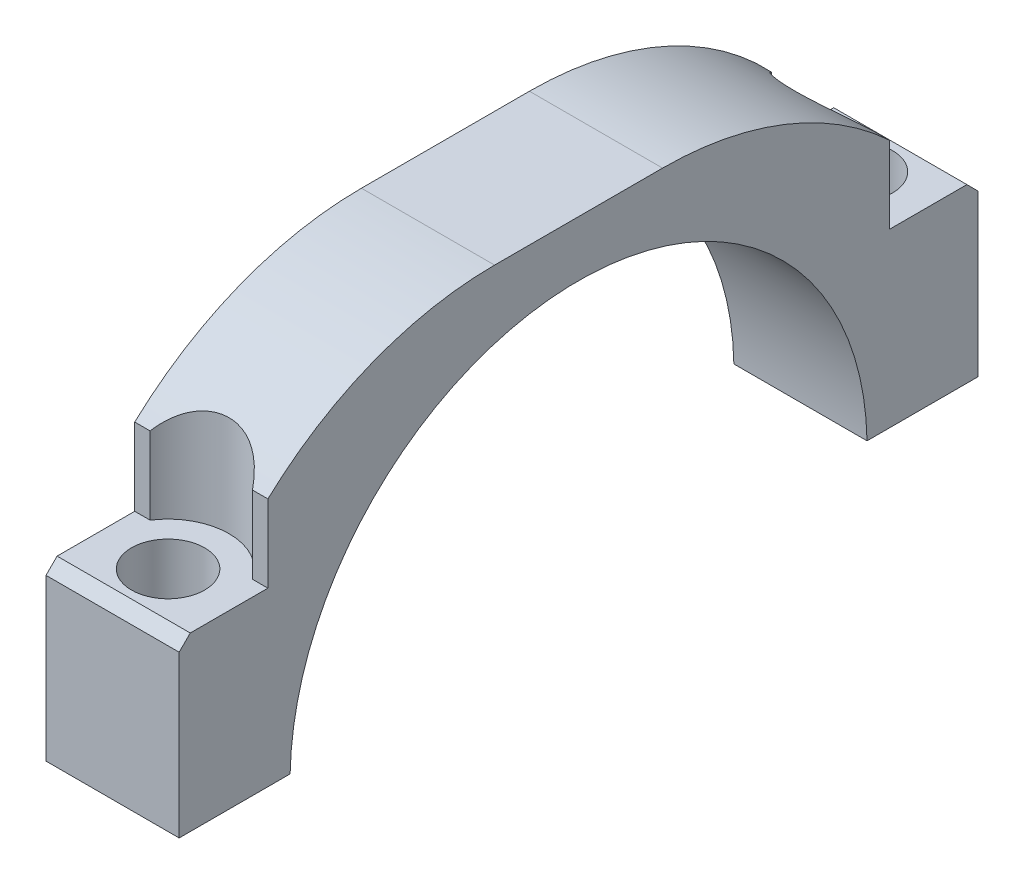
ISO-10303-21;
HEADER;
FILE_DESCRIPTION(('STEP AP214'),'2;1');
FILE_NAME('part.step','',(''),(''),'','','');
FILE_SCHEMA(('AUTOMOTIVE_DESIGN { 1 0 10303 214 1 1 1 1 }'));
ENDSEC;
DATA;
#1=APPLICATION_CONTEXT('core data for automotive mechanical design processes');
#2=APPLICATION_PROTOCOL_DEFINITION('international standard','automotive_design',2000,#1);
#3=PRODUCT_CONTEXT('',#1,'mechanical');
#4=PRODUCT('Part','Part','',(#3));
#5=PRODUCT_RELATED_PRODUCT_CATEGORY('part','',(#4));
#6=PRODUCT_DEFINITION_FORMATION('','',#4);
#7=PRODUCT_DEFINITION_CONTEXT('part definition',#1,'design');
#8=PRODUCT_DEFINITION('design','',#6,#7);
#9=PRODUCT_DEFINITION_SHAPE('','',#8);
#10=(LENGTH_UNIT() NAMED_UNIT(*) SI_UNIT(.MILLI.,.METRE.));
#11=(NAMED_UNIT(*) PLANE_ANGLE_UNIT() SI_UNIT($,.RADIAN.));
#12=(NAMED_UNIT(*) SI_UNIT($,.STERADIAN.) SOLID_ANGLE_UNIT());
#13=UNCERTAINTY_MEASURE_WITH_UNIT(LENGTH_MEASURE(1.E-05),#10,'distance_accuracy_value','');
#14=(GEOMETRIC_REPRESENTATION_CONTEXT(3) GLOBAL_UNCERTAINTY_ASSIGNED_CONTEXT((#13)) GLOBAL_UNIT_ASSIGNED_CONTEXT((#10,
#11,#12)) REPRESENTATION_CONTEXT('',''));
#15=CARTESIAN_POINT('',(0.,0.,0.));
#16=DIRECTION('',(0.,0.,1.));
#17=DIRECTION('',(1.,0.,0.));
#18=AXIS2_PLACEMENT_3D('',#15,#16,#17);
#19=CARTESIAN_POINT('',(12.,-16.,35.9951918631119));
#20=DIRECTION('',(0.,-0.707106781186548,-0.707106781186546));
#21=DIRECTION('',(-1.,0.,0.));
#22=AXIS2_PLACEMENT_3D('',#19,#20,#21);
#23=PLANE('',#22);
#24=DIRECTION('',(0.,0.707106781186547,-0.707106781186549));
#25=VECTOR('',#24,1.);
#26=CARTESIAN_POINT('',(12.,-5.50240406844402,25.4975959315559));
#27=LINE('',#26,#25);
#28=CARTESIAN_POINT('',(12.,-15.,34.9951918631119));
#29=VERTEX_POINT('',#28);
#30=CARTESIAN_POINT('',(12.,-16.,35.9951918631119));
#31=VERTEX_POINT('',#30);
#32=EDGE_CURVE('E339',#29,#31,#27,.F.);
#33=ORIENTED_EDGE('',*,*,#32,.F.);
#34=DIRECTION('',(1.,0.,0.));
#35=VECTOR('',#34,1.);
#36=CARTESIAN_POINT('',(12.,-15.,34.9951918631119));
#37=LINE('',#36,#35);
#38=CARTESIAN_POINT('',(0.,-15.,34.9951918631119));
#39=VERTEX_POINT('',#38);
#40=EDGE_CURVE('E230',#29,#39,#37,.F.);
#41=ORIENTED_EDGE('',*,*,#40,.T.);
#42=DIRECTION('',(0.,-0.707106781186547,0.707106781186549));
#43=VECTOR('',#42,1.);
#44=CARTESIAN_POINT('',(0.,-16.,35.9951918631119));
#45=LINE('',#44,#43);
#46=CARTESIAN_POINT('',(0.,-16.,35.9951918631119));
#47=VERTEX_POINT('',#46);
#48=EDGE_CURVE('E332',#47,#39,#45,.F.);
#49=ORIENTED_EDGE('',*,*,#48,.F.);
#50=DIRECTION('',(-1.,0.,0.));
#51=VECTOR('',#50,1.);
#52=CARTESIAN_POINT('',(12.,-16.,35.9951918631119));
#53=LINE('',#52,#51);
#54=EDGE_CURVE('E344',#31,#47,#53,.T.);
#55=ORIENTED_EDGE('',*,*,#54,.F.);
#56=EDGE_LOOP('',(#33,#41,#49,#55));
#57=FACE_BOUND('',#56,.T.);
#58=ADVANCED_FACE('F97',(#57),#23,.F.);
#59=CARTESIAN_POINT('',(12.,0.,-19.9951918631119));
#60=DIRECTION('',(0.,-0.707106781186546,0.707106781186548));
#61=DIRECTION('',(-1.,0.,0.));
#62=AXIS2_PLACEMENT_3D('',#59,#60,#61);
#63=PLANE('',#62);
#64=DIRECTION('',(0.,0.707106781186549,0.707106781186546));
#65=VECTOR('',#64,1.);
#66=CARTESIAN_POINT('',(0.,0.,-19.9951918631119));
#67=LINE('',#66,#65);
#68=CARTESIAN_POINT('',(0.,-15.,-34.9951918631119));
#69=VERTEX_POINT('',#68);
#70=CARTESIAN_POINT('',(0.,-16.,-35.9951918631119));
#71=VERTEX_POINT('',#70);
#72=EDGE_CURVE('E335',#69,#71,#67,.F.);
#73=ORIENTED_EDGE('',*,*,#72,.F.);
#74=DIRECTION('',(-1.,0.,0.));
#75=VECTOR('',#74,1.);
#76=CARTESIAN_POINT('',(12.,-15.,-34.9951918631119));
#77=LINE('',#76,#75);
#78=CARTESIAN_POINT('',(12.,-15.,-34.9951918631119));
#79=VERTEX_POINT('',#78);
#80=EDGE_CURVE('E278',#69,#79,#77,.F.);
#81=ORIENTED_EDGE('',*,*,#80,.T.);
#82=DIRECTION('',(0.,-0.707106781186549,-0.707106781186546));
#83=VECTOR('',#82,1.);
#84=CARTESIAN_POINT('',(12.,-5.50240406844408,-25.497595931556));
#85=LINE('',#84,#83);
#86=CARTESIAN_POINT('',(12.,-16.,-35.9951918631119));
#87=VERTEX_POINT('',#86);
#88=EDGE_CURVE('E341',#87,#79,#85,.F.);
#89=ORIENTED_EDGE('',*,*,#88,.F.);
#90=DIRECTION('',(1.,0.,0.));
#91=VECTOR('',#90,1.);
#92=CARTESIAN_POINT('',(12.,-16.,-35.9951918631119));
#93=LINE('',#92,#91);
#94=EDGE_CURVE('E337',#71,#87,#93,.T.);
#95=ORIENTED_EDGE('',*,*,#94,.F.);
#96=EDGE_LOOP('',(#73,#81,#89,#95));
#97=FACE_BOUND('',#96,.T.);
#98=ADVANCED_FACE('F389',(#97),#63,.F.);
#99=CARTESIAN_POINT('',(6.,-30.5000000000001,-30.9951918631119));
#100=DIRECTION('',(0.,-1.,0.));
#101=DIRECTION('',(0.,0.,-1.));
#102=AXIS2_PLACEMENT_3D('',#99,#100,#101);
#103=CYLINDRICAL_SURFACE('',#102,3.29999999999999);
#104=CARTESIAN_POINT('',(6.,-30.5000000000001,-30.9951918631119));
#105=DIRECTION('',(0.,-1.,0.));
#106=DIRECTION('',(0.,0.,-1.));
#107=AXIS2_PLACEMENT_3D('',#104,#105,#106);
#108=CIRCLE('',#107,3.3);
#109=CARTESIAN_POINT('',(6.,-30.5000000000001,-34.2951918631119));
#110=VERTEX_POINT('',#109);
#111=EDGE_CURVE('E289',#110,#110,#108,.T.);
#112=ORIENTED_EDGE('',*,*,#111,.T.);
#113=EDGE_LOOP('',(#112));
#114=FACE_BOUND('',#113,.T.);
#115=CARTESIAN_POINT('',(6.,-15.,-30.9951918631119));
#116=DIRECTION('',(0.,1.,0.));
#117=DIRECTION('',(0.,0.,1.));
#118=AXIS2_PLACEMENT_3D('',#115,#116,#117);
#119=CIRCLE('',#118,3.29999999999999);
#120=CARTESIAN_POINT('',(6.,-15.,-27.6951918631119));
#121=VERTEX_POINT('',#120);
#122=EDGE_CURVE('E277',#121,#121,#119,.F.);
#123=ORIENTED_EDGE('',*,*,#122,.F.);
#124=EDGE_LOOP('',(#123));
#125=FACE_BOUND('',#124,.T.);
#126=ADVANCED_FACE('F385',(#114,#125),#103,.F.);
#127=CARTESIAN_POINT('',(6.,-30.5000000000001,30.9951918631119));
#128=DIRECTION('',(0.,-1.,0.));
#129=DIRECTION('',(0.,0.,-1.));
#130=AXIS2_PLACEMENT_3D('',#127,#128,#129);
#131=CYLINDRICAL_SURFACE('',#130,3.29999999999999);
#132=CARTESIAN_POINT('',(6.,-30.5000000000001,30.9951918631119));
#133=DIRECTION('',(0.,-1.,0.));
#134=DIRECTION('',(0.,0.,-1.));
#135=AXIS2_PLACEMENT_3D('',#132,#133,#134);
#136=CIRCLE('',#135,3.3);
#137=CARTESIAN_POINT('',(6.,-30.5000000000001,27.6951918631119));
#138=VERTEX_POINT('',#137);
#139=EDGE_CURVE('E286',#138,#138,#136,.T.);
#140=ORIENTED_EDGE('',*,*,#139,.T.);
#141=EDGE_LOOP('',(#140));
#142=FACE_BOUND('',#141,.T.);
#143=CARTESIAN_POINT('',(6.,-15.,30.9951918631119));
#144=DIRECTION('',(0.,1.,0.));
#145=DIRECTION('',(0.,0.,1.));
#146=AXIS2_PLACEMENT_3D('',#143,#144,#145);
#147=CIRCLE('',#146,3.29999999999999);
#148=CARTESIAN_POINT('',(6.,-15.,34.2951918631119));
#149=VERTEX_POINT('',#148);
#150=EDGE_CURVE('E283',#149,#149,#147,.F.);
#151=ORIENTED_EDGE('',*,*,#150,.F.);
#152=EDGE_LOOP('',(#151));
#153=FACE_BOUND('',#152,.T.);
#154=ADVANCED_FACE('F381',(#142,#153),#131,.F.);
#155=CARTESIAN_POINT('',(12.,0.,35.9951918631119));
#156=DIRECTION('',(0.,0.,-1.));
#157=DIRECTION('',(0.,1.,0.));
#158=AXIS2_PLACEMENT_3D('',#155,#156,#157);
#159=PLANE('',#158);
#160=DIRECTION('',(0.,-1.,0.));
#161=VECTOR('',#160,1.);
#162=CARTESIAN_POINT('',(12.,0.,35.9951918631119));
#163=LINE('',#162,#161);
#164=CARTESIAN_POINT('',(12.,-30.5,35.9951918631119));
#165=VERTEX_POINT('',#164);
#166=EDGE_CURVE('E293',#31,#165,#163,.T.);
#167=ORIENTED_EDGE('',*,*,#166,.F.);
#168=ORIENTED_EDGE('',*,*,#54,.T.);
#169=DIRECTION('',(0.,-1.,0.));
#170=VECTOR('',#169,1.);
#171=CARTESIAN_POINT('',(0.,0.,35.9951918631119));
#172=LINE('',#171,#170);
#173=CARTESIAN_POINT('',(0.,-30.5,35.9951918631119));
#174=VERTEX_POINT('',#173);
#175=EDGE_CURVE('E292',#47,#174,#172,.T.);
#176=ORIENTED_EDGE('',*,*,#175,.T.);
#177=DIRECTION('',(-1.,0.,0.));
#178=VECTOR('',#177,1.);
#179=CARTESIAN_POINT('',(12.,-30.5,35.9951918631119));
#180=LINE('',#179,#178);
#181=EDGE_CURVE('E329',#165,#174,#180,.T.);
#182=ORIENTED_EDGE('',*,*,#181,.F.);
#183=EDGE_LOOP('',(#167,#168,#176,#182));
#184=FACE_BOUND('',#183,.T.);
#185=ADVANCED_FACE('F384',(#184),#159,.F.);
#186=CARTESIAN_POINT('',(12.,-30.5,35.9951918631119));
#187=DIRECTION('',(0.,1.,0.));
#188=DIRECTION('',(0.,0.,1.));
#189=AXIS2_PLACEMENT_3D('',#186,#187,#188);
#190=PLANE('',#189);
#191=ORIENTED_EDGE('',*,*,#139,.F.);
#192=EDGE_LOOP('',(#191));
#193=FACE_BOUND('',#192,.T.);
#194=DIRECTION('',(0.,0.,-1.));
#195=VECTOR('',#194,1.);
#196=CARTESIAN_POINT('',(0.,-30.5,35.9951918631119));
#197=LINE('',#196,#195);
#198=CARTESIAN_POINT('',(0.,-30.5,25.9951918631119));
#199=VERTEX_POINT('',#198);
#200=EDGE_CURVE('E309',#174,#199,#197,.T.);
#201=ORIENTED_EDGE('',*,*,#200,.T.);
#202=DIRECTION('',(-1.,0.,0.));
#203=VECTOR('',#202,1.);
#204=CARTESIAN_POINT('',(12.,-30.5,25.9951918631119));
#205=LINE('',#204,#203);
#206=CARTESIAN_POINT('',(12.,-30.5,25.9951918631119));
#207=VERTEX_POINT('',#206);
#208=EDGE_CURVE('E326',#207,#199,#205,.T.);
#209=ORIENTED_EDGE('',*,*,#208,.F.);
#210=DIRECTION('',(0.,0.,-1.));
#211=VECTOR('',#210,1.);
#212=CARTESIAN_POINT('',(12.,-30.5,35.9951918631119));
#213=LINE('',#212,#211);
#214=EDGE_CURVE('E295',#165,#207,#213,.T.);
#215=ORIENTED_EDGE('',*,*,#214,.F.);
#216=ORIENTED_EDGE('',*,*,#181,.T.);
#217=EDGE_LOOP('',(#201,#209,#215,#216));
#218=FACE_BOUND('',#217,.T.);
#219=ADVANCED_FACE('F413',(#193,#218),#190,.F.);
#220=CARTESIAN_POINT('',(12.,-31.,0.));
#221=DIRECTION('',(-1.,0.,0.));
#222=DIRECTION('',(0.,0.,1.));
#223=AXIS2_PLACEMENT_3D('',#220,#221,#222);
#224=CYLINDRICAL_SURFACE('',#223,26.);
#225=CARTESIAN_POINT('',(0.,-31.,0.));
#226=DIRECTION('',(-1.,0.,0.));
#227=DIRECTION('',(0.,0.,-1.));
#228=AXIS2_PLACEMENT_3D('',#225,#226,#227);
#229=CIRCLE('',#228,26.);
#230=CARTESIAN_POINT('',(0.,-30.5,-25.9951918631119));
#231=VERTEX_POINT('',#230);
#232=EDGE_CURVE('E311',#199,#231,#229,.T.);
#233=ORIENTED_EDGE('',*,*,#232,.T.);
#234=DIRECTION('',(-1.,0.,0.));
#235=VECTOR('',#234,1.);
#236=CARTESIAN_POINT('',(12.,-30.5,-25.9951918631119));
#237=LINE('',#236,#235);
#238=CARTESIAN_POINT('',(12.,-30.5,-25.9951918631119));
#239=VERTEX_POINT('',#238);
#240=EDGE_CURVE('E323',#239,#231,#237,.T.);
#241=ORIENTED_EDGE('',*,*,#240,.F.);
#242=CARTESIAN_POINT('',(12.,-31.,0.));
#243=DIRECTION('',(-1.,0.,0.));
#244=DIRECTION('',(0.,0.,-1.));
#245=AXIS2_PLACEMENT_3D('',#242,#243,#244);
#246=CIRCLE('',#245,26.);
#247=EDGE_CURVE('E298',#207,#239,#246,.T.);
#248=ORIENTED_EDGE('',*,*,#247,.F.);
#249=ORIENTED_EDGE('',*,*,#208,.T.);
#250=EDGE_LOOP('',(#233,#241,#248,#249));
#251=FACE_BOUND('',#250,.T.);
#252=ADVANCED_FACE('F409',(#251),#224,.F.);
#253=CARTESIAN_POINT('',(12.,-30.5,-35.9951918631119));
#254=DIRECTION('',(0.,1.,0.));
#255=DIRECTION('',(0.,0.,1.));
#256=AXIS2_PLACEMENT_3D('',#253,#254,#255);
#257=PLANE('',#256);
#258=ORIENTED_EDGE('',*,*,#111,.F.);
#259=EDGE_LOOP('',(#258));
#260=FACE_BOUND('',#259,.T.);
#261=DIRECTION('',(0.,0.,-1.));
#262=VECTOR('',#261,1.);
#263=CARTESIAN_POINT('',(0.,-30.5,-35.9951918631119));
#264=LINE('',#263,#262);
#265=CARTESIAN_POINT('',(0.,-30.5,-35.9951918631119));
#266=VERTEX_POINT('',#265);
#267=EDGE_CURVE('E314',#231,#266,#264,.T.);
#268=ORIENTED_EDGE('',*,*,#267,.T.);
#269=DIRECTION('',(-1.,0.,0.));
#270=VECTOR('',#269,1.);
#271=CARTESIAN_POINT('',(12.,-30.5,-35.9951918631119));
#272=LINE('',#271,#270);
#273=CARTESIAN_POINT('',(12.,-30.5,-35.9951918631119));
#274=VERTEX_POINT('',#273);
#275=EDGE_CURVE('E307',#274,#266,#272,.T.);
#276=ORIENTED_EDGE('',*,*,#275,.F.);
#277=DIRECTION('',(0.,0.,-1.));
#278=VECTOR('',#277,1.);
#279=CARTESIAN_POINT('',(12.,-30.5,-35.9951918631119));
#280=LINE('',#279,#278);
#281=EDGE_CURVE('E300',#239,#274,#280,.T.);
#282=ORIENTED_EDGE('',*,*,#281,.F.);
#283=ORIENTED_EDGE('',*,*,#240,.T.);
#284=EDGE_LOOP('',(#268,#276,#282,#283));
#285=FACE_BOUND('',#284,.T.);
#286=ADVANCED_FACE('F405',(#260,#285),#257,.F.);
#287=CARTESIAN_POINT('',(12.,0.,-35.9951918631119));
#288=DIRECTION('',(0.,0.,1.));
#289=DIRECTION('',(0.,-1.,0.));
#290=AXIS2_PLACEMENT_3D('',#287,#288,#289);
#291=PLANE('',#290);
#292=DIRECTION('',(0.,1.,0.));
#293=VECTOR('',#292,1.);
#294=CARTESIAN_POINT('',(0.,0.,-35.9951918631119));
#295=LINE('',#294,#293);
#296=EDGE_CURVE('E316',#266,#71,#295,.T.);
#297=ORIENTED_EDGE('',*,*,#296,.T.);
#298=ORIENTED_EDGE('',*,*,#94,.T.);
#299=DIRECTION('',(0.,1.,0.));
#300=VECTOR('',#299,1.);
#301=CARTESIAN_POINT('',(12.,0.,-35.9951918631119));
#302=LINE('',#301,#300);
#303=EDGE_CURVE('E302',#274,#87,#302,.T.);
#304=ORIENTED_EDGE('',*,*,#303,.F.);
#305=ORIENTED_EDGE('',*,*,#275,.T.);
#306=EDGE_LOOP('',(#297,#298,#304,#305));
#307=FACE_BOUND('',#306,.T.);
#308=ADVANCED_FACE('F401',(#307),#291,.F.);
#309=CARTESIAN_POINT('',(12.,0.,35.9951918631119));
#310=DIRECTION('',(0.,-1.,0.));
#311=DIRECTION('',(0.,0.,-1.));
#312=AXIS2_PLACEMENT_3D('',#309,#310,#311);
#313=PLANE('',#312);
#314=DIRECTION('',(0.,0.,1.));
#315=VECTOR('',#314,1.);
#316=CARTESIAN_POINT('',(12.,0.,35.9951918631119));
#317=LINE('',#316,#315);
#318=CARTESIAN_POINT('',(12.,0.,-7.56878499191906));
#319=VERTEX_POINT('',#318);
#320=CARTESIAN_POINT('',(12.,0.,7.56878499191905));
#321=VERTEX_POINT('',#320);
#322=EDGE_CURVE('E305',#319,#321,#317,.T.);
#323=ORIENTED_EDGE('',*,*,#322,.F.);
#324=DIRECTION('',(1.,0.,0.));
#325=VECTOR('',#324,1.);
#326=CARTESIAN_POINT('',(0.,0.,-7.56878499191907));
#327=LINE('',#326,#325);
#328=CARTESIAN_POINT('',(0.,0.,-7.56878499191906));
#329=VERTEX_POINT('',#328);
#330=EDGE_CURVE('E350',#319,#329,#327,.F.);
#331=ORIENTED_EDGE('',*,*,#330,.T.);
#332=DIRECTION('',(0.,0.,1.));
#333=VECTOR('',#332,1.);
#334=CARTESIAN_POINT('',(0.,0.,35.9951918631119));
#335=LINE('',#334,#333);
#336=CARTESIAN_POINT('',(0.,0.,7.56878499191905));
#337=VERTEX_POINT('',#336);
#338=EDGE_CURVE('E296',#329,#337,#335,.T.);
#339=ORIENTED_EDGE('',*,*,#338,.T.);
#340=DIRECTION('',(-1.,0.,0.));
#341=VECTOR('',#340,1.);
#342=CARTESIAN_POINT('',(12.,0.,7.56878499191905));
#343=LINE('',#342,#341);
#344=EDGE_CURVE('E347',#337,#321,#343,.F.);
#345=ORIENTED_EDGE('',*,*,#344,.T.);
#346=EDGE_LOOP('',(#323,#331,#339,#345));
#347=FACE_BOUND('',#346,.T.);
#348=ADVANCED_FACE('F394',(#347),#313,.F.);
#349=CARTESIAN_POINT('',(12.,-31.,0.));
#350=DIRECTION('',(1.,0.,0.));
#351=DIRECTION('',(0.,0.,-1.));
#352=AXIS2_PLACEMENT_3D('',#349,#350,#351);
#353=PLANE('',#352);
#354=DIRECTION('',(0.,1.,0.));
#355=VECTOR('',#354,1.);
#356=CARTESIAN_POINT('',(12.,-31.,28.));
#357=LINE('',#356,#355);
#358=CARTESIAN_POINT('',(12.,-15.,28.));
#359=VERTEX_POINT('',#358);
#360=CARTESIAN_POINT('',(12.,-8.03262752868319,28.));
#361=VERTEX_POINT('',#360);
#362=EDGE_CURVE('E240',#359,#361,#357,.T.);
#363=ORIENTED_EDGE('',*,*,#362,.F.);
#364=DIRECTION('',(0.,0.,1.));
#365=VECTOR('',#364,1.);
#366=CARTESIAN_POINT('',(12.,-15.,0.));
#367=LINE('',#366,#365);
#368=EDGE_CURVE('E227',#359,#29,#367,.T.);
#369=ORIENTED_EDGE('',*,*,#368,.T.);
#370=ORIENTED_EDGE('',*,*,#32,.T.);
#371=ORIENTED_EDGE('',*,*,#166,.T.);
#372=ORIENTED_EDGE('',*,*,#214,.T.);
#373=ORIENTED_EDGE('',*,*,#247,.T.);
#374=ORIENTED_EDGE('',*,*,#281,.T.);
#375=ORIENTED_EDGE('',*,*,#303,.T.);
#376=ORIENTED_EDGE('',*,*,#88,.T.);
#377=DIRECTION('',(0.,0.,1.));
#378=VECTOR('',#377,1.);
#379=CARTESIAN_POINT('',(12.,-15.,0.));
#380=LINE('',#379,#378);
#381=CARTESIAN_POINT('',(12.,-15.,-28.));
#382=VERTEX_POINT('',#381);
#383=EDGE_CURVE('E262',#79,#382,#380,.T.);
#384=ORIENTED_EDGE('',*,*,#383,.T.);
#385=DIRECTION('',(0.,-1.,0.));
#386=VECTOR('',#385,1.);
#387=CARTESIAN_POINT('',(12.,-31.,-28.));
#388=LINE('',#387,#386);
#389=CARTESIAN_POINT('',(12.,-8.03262752868317,-28.));
#390=VERTEX_POINT('',#389);
#391=EDGE_CURVE('E273',#390,#382,#388,.T.);
#392=ORIENTED_EDGE('',*,*,#391,.F.);
#393=CARTESIAN_POINT('',(12.,-30.,-7.56878499191907));
#394=DIRECTION('',(1.,0.,0.));
#395=DIRECTION('',(0.,0.,-1.));
#396=AXIS2_PLACEMENT_3D('',#393,#394,#395);
#397=CIRCLE('',#396,30.);
#398=EDGE_CURVE('E359',#390,#319,#397,.T.);
#399=ORIENTED_EDGE('',*,*,#398,.T.);
#400=ORIENTED_EDGE('',*,*,#322,.T.);
#401=CARTESIAN_POINT('',(12.,-30.,7.56878499191905));
#402=DIRECTION('',(1.,0.,0.));
#403=DIRECTION('',(0.,0.,-1.));
#404=AXIS2_PLACEMENT_3D('',#401,#402,#403);
#405=CIRCLE('',#404,30.);
#406=EDGE_CURVE('E250',#321,#361,#405,.T.);
#407=ORIENTED_EDGE('',*,*,#406,.T.);
#408=EDGE_LOOP('',(#363,#369,#370,#371,#372,#373,#374,#375,#376,#384,#392,#399,#400,#407));
#409=FACE_BOUND('',#408,.T.);
#410=ADVANCED_FACE('F248',(#409),#353,.T.);
#411=CARTESIAN_POINT('',(0.,-31.,0.));
#412=DIRECTION('',(1.,0.,0.));
#413=DIRECTION('',(0.,0.,-1.));
#414=AXIS2_PLACEMENT_3D('',#411,#412,#413);
#415=PLANE('',#414);
#416=DIRECTION('',(0.,0.,1.));
#417=VECTOR('',#416,1.);
#418=CARTESIAN_POINT('',(0.,-15.,0.));
#419=LINE('',#418,#417);
#420=CARTESIAN_POINT('',(0.,-15.,28.));
#421=VERTEX_POINT('',#420);
#422=EDGE_CURVE('E236',#421,#39,#419,.T.);
#423=ORIENTED_EDGE('',*,*,#422,.F.);
#424=DIRECTION('',(0.,1.,0.));
#425=VECTOR('',#424,1.);
#426=CARTESIAN_POINT('',(0.,-31.,28.));
#427=LINE('',#426,#425);
#428=CARTESIAN_POINT('',(0.,-8.03262752868319,28.));
#429=VERTEX_POINT('',#428);
#430=EDGE_CURVE('E254',#421,#429,#427,.T.);
#431=ORIENTED_EDGE('',*,*,#430,.T.);
#432=CARTESIAN_POINT('',(0.,-30.,7.56878499191905));
#433=DIRECTION('',(1.,0.,0.));
#434=DIRECTION('',(0.,0.,-1.));
#435=AXIS2_PLACEMENT_3D('',#432,#433,#434);
#436=CIRCLE('',#435,30.);
#437=EDGE_CURVE('E353',#429,#337,#436,.F.);
#438=ORIENTED_EDGE('',*,*,#437,.T.);
#439=ORIENTED_EDGE('',*,*,#338,.F.);
#440=CARTESIAN_POINT('',(0.,-30.,-7.56878499191907));
#441=DIRECTION('',(1.,0.,0.));
#442=DIRECTION('',(0.,0.,-1.));
#443=AXIS2_PLACEMENT_3D('',#440,#441,#442);
#444=CIRCLE('',#443,30.);
#445=CARTESIAN_POINT('',(0.,-8.03262752868317,-28.));
#446=VERTEX_POINT('',#445);
#447=EDGE_CURVE('E355',#329,#446,#444,.F.);
#448=ORIENTED_EDGE('',*,*,#447,.T.);
#449=DIRECTION('',(0.,-1.,0.));
#450=VECTOR('',#449,1.);
#451=CARTESIAN_POINT('',(0.,-31.,-28.));
#452=LINE('',#451,#450);
#453=CARTESIAN_POINT('',(0.,-15.,-28.));
#454=VERTEX_POINT('',#453);
#455=EDGE_CURVE('E269',#446,#454,#452,.T.);
#456=ORIENTED_EDGE('',*,*,#455,.T.);
#457=DIRECTION('',(0.,0.,1.));
#458=VECTOR('',#457,1.);
#459=CARTESIAN_POINT('',(0.,-15.,0.));
#460=LINE('',#459,#458);
#461=EDGE_CURVE('E265',#69,#454,#460,.T.);
#462=ORIENTED_EDGE('',*,*,#461,.F.);
#463=ORIENTED_EDGE('',*,*,#72,.T.);
#464=ORIENTED_EDGE('',*,*,#296,.F.);
#465=ORIENTED_EDGE('',*,*,#267,.F.);
#466=ORIENTED_EDGE('',*,*,#232,.F.);
#467=ORIENTED_EDGE('',*,*,#200,.F.);
#468=ORIENTED_EDGE('',*,*,#175,.F.);
#469=ORIENTED_EDGE('',*,*,#48,.T.);
#470=EDGE_LOOP('',(#423,#431,#438,#439,#448,#456,#462,#463,#464,#465,#466,#467,#468,#469));
#471=FACE_BOUND('',#470,.T.);
#472=ADVANCED_FACE('F393',(#471),#415,.F.);
#473=CARTESIAN_POINT('',(12.,-30.,-7.56878499191907));
#474=DIRECTION('',(-1.,0.,0.));
#475=DIRECTION('',(0.,0.,1.));
#476=AXIS2_PLACEMENT_3D('',#473,#474,#475);
#477=CYLINDRICAL_SURFACE('',#476,30.);
#478=DIRECTION('',(-1.,0.,0.));
#479=VECTOR('',#478,1.);
#480=CARTESIAN_POINT('',(12.,-8.03262752868317,-28.));
#481=LINE('',#480,#479);
#482=CARTESIAN_POINT('',(1.3871022444511,-8.03262752868317,-28.));
#483=VERTEX_POINT('',#482);
#484=EDGE_CURVE('E267',#446,#483,#481,.F.);
#485=ORIENTED_EDGE('',*,*,#484,.F.);
#486=ORIENTED_EDGE('',*,*,#447,.F.);
#487=ORIENTED_EDGE('',*,*,#330,.F.);
#488=ORIENTED_EDGE('',*,*,#398,.F.);
#489=CARTESIAN_POINT('',(10.6128977555489,-8.03262752868317,-28.));
#490=VERTEX_POINT('',#489);
#491=EDGE_CURVE('E270',#490,#390,#481,.F.);
#492=ORIENTED_EDGE('',*,*,#491,.F.);
#493=CARTESIAN_POINT('',(1.12914080516294,-15.,-33.5495471054522));
#494=CARTESIAN_POINT('',(1.07037826514827,-14.805863851197,-33.4374657080568));
#495=CARTESIAN_POINT('',(1.01513060567362,-14.6121767394934,-33.3227359781441));
#496=CARTESIAN_POINT('',(0.912110179795308,-14.2259497872558,-33.088000882944));
#497=CARTESIAN_POINT('',(0.864339251760836,-14.0334102400427,-32.9679942294357));
#498=CARTESIAN_POINT('',(0.776558819232649,-13.6490003537471,-32.7222553660083));
#499=CARTESIAN_POINT('',(0.736583493650419,-13.4571364300004,-32.5965008002143));
#500=CARTESIAN_POINT('',(0.665249122327001,-13.0752777953063,-32.339871402251));
#501=CARTESIAN_POINT('',(0.633889472350553,-12.8852829541779,-32.2089969298873));
#502=CARTESIAN_POINT('',(0.552921333115735,-12.3129877704568,-31.8049078152736));
#503=CARTESIAN_POINT('',(0.517749784805714,-11.9340228104916,-31.5238281447705));
#504=CARTESIAN_POINT('',(0.492600330044044,-11.1893979465917,-30.9436256955275));
#505=CARTESIAN_POINT('',(0.502530988529331,-10.8237126376714,-30.6445406331523));
#506=CARTESIAN_POINT('',(0.557416944282137,-10.2918106979647,-30.1882619558858));
#507=CARTESIAN_POINT('',(0.581965058228471,-10.1188326567222,-30.0363573415844));
#508=CARTESIAN_POINT('',(0.645231309066514,-9.77780667742746,-29.7299081564722));
#509=CARTESIAN_POINT('',(0.683949869863115,-9.60975888702472,-29.5753635068173));
#510=CARTESIAN_POINT('',(0.776649500998128,-9.28009949696876,-29.2652527923666));
#511=CARTESIAN_POINT('',(0.83057155110552,-9.11846571282006,-29.109692906146));
#512=CARTESIAN_POINT('',(0.955000217996856,-8.80201295867417,-28.7983562044466));
#513=CARTESIAN_POINT('',(1.02550371949719,-8.64719271504353,-28.6425794351737));
#514=CARTESIAN_POINT('',(1.23576170189845,-8.24797336671048,-28.2321724692718));
#515=CARTESIAN_POINT('',(1.39084818186247,-8.01022357788019,-27.9786060750825));
#516=CARTESIAN_POINT('',(1.75443755131895,-7.56251889937233,-27.48536703564));
#517=CARTESIAN_POINT('',(1.9628955234413,-7.35254086129932,-27.245682914071));
#518=CARTESIAN_POINT('',(2.38587647119762,-7.00815894974485,-26.8413161123711));
#519=CARTESIAN_POINT('',(2.58994661884033,-6.86714267474415,-26.6714494146115));
#520=CARTESIAN_POINT('',(2.92091803310384,-6.67523896643961,-26.4358426307969));
#521=CARTESIAN_POINT('',(3.03543495350841,-6.61452164094924,-26.3604806682041));
#522=CARTESIAN_POINT('',(3.27234659019942,-6.5001203014445,-26.2172175182988));
#523=CARTESIAN_POINT('',(3.39473782365235,-6.44643320939835,-26.149313067995));
#524=CARTESIAN_POINT('',(3.64781589113069,-6.34617328931503,-26.0215122334604));
#525=CARTESIAN_POINT('',(3.7785611292609,-6.29966065083293,-25.9616840765395));
#526=CARTESIAN_POINT('',(4.04654749760141,-6.21475297525036,-25.8517510877022));
#527=CARTESIAN_POINT('',(4.18378537457409,-6.17635392434704,-25.8016414490339));
#528=CARTESIAN_POINT('',(4.46371303605967,-6.10806603163086,-25.7120666071699));
#529=CARTESIAN_POINT('',(4.60640139313891,-6.07817497874424,-25.6725986385388));
#530=CARTESIAN_POINT('',(4.89599193923397,-6.02722986718919,-25.6050841707157));
#531=CARTESIAN_POINT('',(5.0428935183196,-6.00617453624075,-25.5770360271687));
#532=CARTESIAN_POINT('',(5.32092237295183,-5.97520881388857,-25.5356985653719));
#533=CARTESIAN_POINT('',(5.45172441182689,-5.96423382131593,-25.5210020227954));
#534=CARTESIAN_POINT('',(5.71444134285945,-5.94933022000542,-25.5010308496226));
#535=CARTESIAN_POINT('',(5.84635614205788,-5.9454010284111,-25.4957554396731));
#536=CARTESIAN_POINT('',(6.11019701176323,-5.94462501306384,-25.4947140881422));
#537=CARTESIAN_POINT('',(6.24212306295836,-5.94777576566852,-25.4989448923452));
#538=CARTESIAN_POINT('',(6.50497363234935,-5.96112544119957,-25.5168387715571));
#539=CARTESIAN_POINT('',(6.63589816597809,-5.97132425529675,-25.5305017009243));
#540=CARTESIAN_POINT('',(6.8882449103671,-5.99788893152819,-25.565982620654));
#541=CARTESIAN_POINT('',(7.00978088992425,-6.01386680521137,-25.5872869680389));
#542=CARTESIAN_POINT('',(7.25027978662581,-6.0518778819671,-25.6377762455569));
#543=CARTESIAN_POINT('',(7.36924187035121,-6.0739130156214,-25.6669636881536));
#544=CARTESIAN_POINT('',(7.60376380357122,-6.12385562150669,-25.732799788706));
#545=CARTESIAN_POINT('',(7.71932495443044,-6.15176081336448,-25.7694455491097));
#546=CARTESIAN_POINT('',(7.94647889465897,-6.21325010456801,-25.8497337077988));
#547=CARTESIAN_POINT('',(8.05807016662662,-6.24683634773818,-25.8933787470364));
#548=CARTESIAN_POINT('',(8.2810059566507,-6.32088045437415,-25.9889665894517));
#549=CARTESIAN_POINT('',(8.39216637919304,-6.36155745483907,-26.0411691846698));
#550=CARTESIAN_POINT('',(8.6090524406748,-6.44848984347889,-26.1518776416192));
#551=CARTESIAN_POINT('',(8.71477609691565,-6.49474724644416,-26.2103857791327));
#552=CARTESIAN_POINT('',(9.02311604214602,-6.64141558075713,-26.3943276847275));
#553=CARTESIAN_POINT('',(9.21703249228455,-6.74976655346231,-26.5282362920548));
#554=CARTESIAN_POINT('',(9.60169696523847,-6.99934361728875,-26.8304756241306));
#555=CARTESIAN_POINT('',(9.78911236600621,-7.14297521994728,-27.0010146276169));
#556=CARTESIAN_POINT('',(10.1315565011359,-7.44989062315936,-27.3563484155473));
#557=CARTESIAN_POINT('',(10.2865646024996,-7.6131868401055,-27.5411521801587));
#558=CARTESIAN_POINT('',(10.5336419488239,-7.91710684220023,-27.876046388907));
#559=CARTESIAN_POINT('',(10.6320145802048,-8.05448846848921,-28.0245185499414));
#560=CARTESIAN_POINT('',(10.8110482090651,-8.33768490779127,-28.3241841183826));
#561=CARTESIAN_POINT('',(10.8917016762136,-8.48350327313904,-28.4753786533311));
#562=CARTESIAN_POINT('',(11.0364779635911,-8.78257797129881,-28.7788411020993));
#563=CARTESIAN_POINT('',(11.1005714380757,-8.93584694405941,-28.9311104367891));
#564=CARTESIAN_POINT('',(11.213248288302,-9.24854183550018,-29.2349926182621));
#565=CARTESIAN_POINT('',(11.2618317946676,-9.40796770231476,-29.3866054705634));
#566=CARTESIAN_POINT('',(11.3629825860313,-9.80363128147324,-29.7545529120187));
#567=CARTESIAN_POINT('',(11.4078554452602,-10.0427332778051,-29.9699391685793));
#568=CARTESIAN_POINT('',(11.4713183771536,-10.5297762966139,-30.3945365117838));
#569=CARTESIAN_POINT('',(11.4898955560421,-10.7777215942554,-30.6037445198039));
#570=CARTESIAN_POINT('',(11.5038156326565,-11.2812021246692,-31.0147326329045));
#571=CARTESIAN_POINT('',(11.4991051740285,-11.5367534526532,-31.2164946121238));
#572=CARTESIAN_POINT('',(11.4689994491396,-12.0534225243221,-31.6109560028295));
#573=CARTESIAN_POINT('',(11.443608864052,-12.3145389952509,-31.803657454825));
#574=CARTESIAN_POINT('',(11.3828977652139,-12.7765669148895,-32.1332505271944));
#575=CARTESIAN_POINT('',(11.3515428003621,-12.9765288680982,-32.2722337051873));
#576=CARTESIAN_POINT('',(11.2791550020391,-13.3785530071454,-32.5445017746557));
#577=CARTESIAN_POINT('',(11.238122680994,-13.5806150812387,-32.6777869674041));
#578=CARTESIAN_POINT('',(11.1474462381208,-13.9848416830554,-32.93750492296));
#579=CARTESIAN_POINT('',(11.0978729415543,-14.1869927083132,-33.0639836200511));
#580=CARTESIAN_POINT('',(10.990443525499,-14.592598086234,-33.3111316702386));
#581=CARTESIAN_POINT('',(10.9325887228889,-14.7960522267789,-33.4318019428893));
#582=CARTESIAN_POINT('',(10.8708591948371,-15.,-33.5495471054522));
#583=B_SPLINE_CURVE_WITH_KNOTS('',3,(#493,#494,#495,#496,#497,#498,#499,#500,#501,#502,#503,
#504,#505,#506,#507,#508,#509,#510,#511,#512,#513,#514,#515,#516,#517,#518,#519,#520,#521,#522,
#523,#524,#525,#526,#527,#528,#529,#530,#531,#532,#533,#534,#535,#536,#537,#538,#539,#540,#541,
#542,#543,#544,#545,#546,#547,#548,#549,#550,#551,#552,#553,#554,#555,#556,#557,#558,#559,#560,
#561,#562,#563,#564,#565,#566,#567,#568,#569,#570,#571,#572,#573,#574,#575,#576,#577,#578,#579,
#580,#581,#582),.UNSPECIFIED.,.F.,.F.,(4,2,2,2,2,2,2,2,2,2,2,2,2,2,2,2,2,2,2,2,2,2,2,2,2,2,2,2,
2,2,2,2,2,2,2,2,2,2,2,2,2,2,2,2,4),(0.,0.695200628438546,1.39057192428903,2.08892663732053,
2.78723236077316,4.20424721899939,5.61839066687594,6.3125221348877,7.00667436934273,
7.69816814079296,8.38953209967661,9.5269424734294,10.6633987329188,11.5613669909792,
12.0106962953995,12.4598282084548,12.9125441329162,13.3650355711106,13.8174093074271,
14.2697178828301,14.6654514770655,15.0611523331471,15.4567177515434,15.8522770621463,
16.2251098556108,16.5980616171263,16.9708687627377,17.3438169075075,17.7315063138688,
18.1193361158122,18.8945511180539,19.7652568043694,20.6365151724717,21.3104334978501,
21.98463767492,22.6600285304822,23.3354136978039,24.3086906938025,25.28244475955,
26.2584309114156,27.2341961994991,27.9705220243165,28.7068088686679,29.4372606652374,
30.167596438225),.UNSPECIFIED.);
#584=EDGE_CURVE('E371',#483,#490,#583,.T.);
#585=ORIENTED_EDGE('',*,*,#584,.F.);
#586=EDGE_LOOP('',(#485,#486,#487,#488,#492,#585));
#587=FACE_BOUND('',#586,.T.);
#588=ADVANCED_FACE('F397',(#587),#477,.T.);
#589=CARTESIAN_POINT('',(12.,-30.,7.56878499191905));
#590=DIRECTION('',(1.,0.,0.));
#591=DIRECTION('',(0.,0.,-1.));
#592=AXIS2_PLACEMENT_3D('',#589,#590,#591);
#593=CYLINDRICAL_SURFACE('',#592,30.);
#594=DIRECTION('',(1.,0.,0.));
#595=VECTOR('',#594,1.);
#596=CARTESIAN_POINT('',(12.,-8.03262752868319,28.));
#597=LINE('',#596,#595);
#598=CARTESIAN_POINT('',(10.6128977555489,-8.03262752868319,28.));
#599=VERTEX_POINT('',#598);
#600=EDGE_CURVE('E235',#361,#599,#597,.F.);
#601=ORIENTED_EDGE('',*,*,#600,.F.);
#602=ORIENTED_EDGE('',*,*,#406,.F.);
#603=ORIENTED_EDGE('',*,*,#344,.F.);
#604=ORIENTED_EDGE('',*,*,#437,.F.);
#605=CARTESIAN_POINT('',(1.38710224445109,-8.03262752868319,28.));
#606=VERTEX_POINT('',#605);
#607=EDGE_CURVE('E252',#606,#429,#597,.F.);
#608=ORIENTED_EDGE('',*,*,#607,.F.);
#609=CARTESIAN_POINT('',(10.8708591948371,-15.,33.5495471054522));
#610=CARTESIAN_POINT('',(10.9296217348517,-14.805863851197,33.4374657080568));
#611=CARTESIAN_POINT('',(10.9848693943264,-14.6121767394934,33.322735978144));
#612=CARTESIAN_POINT('',(11.0878898202047,-14.2259497872558,33.088000882944));
#613=CARTESIAN_POINT('',(11.1356607482392,-14.0334102400427,32.9679942294357));
#614=CARTESIAN_POINT('',(11.2234411807674,-13.6490003537471,32.7222553660083));
#615=CARTESIAN_POINT('',(11.2634165063496,-13.4571364300004,32.5965008002142));
#616=CARTESIAN_POINT('',(11.334750877673,-13.0752777953063,32.339871402251));
#617=CARTESIAN_POINT('',(11.3661105276494,-12.8852829541779,32.2089969298873));
#618=CARTESIAN_POINT('',(11.4470786668843,-12.3129877704568,31.8049078152736));
#619=CARTESIAN_POINT('',(11.4822502151943,-11.9340228104916,31.5238281447704));
#620=CARTESIAN_POINT('',(11.507399669956,-11.1893979465917,30.9436256955275));
#621=CARTESIAN_POINT('',(11.4974690114707,-10.8237126376714,30.6445406331522));
#622=CARTESIAN_POINT('',(11.4425830557179,-10.2918106979647,30.1882619558857));
#623=CARTESIAN_POINT('',(11.4180349417715,-10.1188326567222,30.0363573415844));
#624=CARTESIAN_POINT('',(11.3547686909335,-9.77780667742745,29.7299081564722));
#625=CARTESIAN_POINT('',(11.3160501301369,-9.60975888702472,29.5753635068172));
#626=CARTESIAN_POINT('',(11.2233504990019,-9.28009949696876,29.2652527923666));
#627=CARTESIAN_POINT('',(11.1694284488945,-9.11846571282006,29.1096929061459));
#628=CARTESIAN_POINT('',(11.0449997820031,-8.80201295867417,28.7983562044466));
#629=CARTESIAN_POINT('',(10.9744962805028,-8.64719271504353,28.6425794351737));
#630=CARTESIAN_POINT('',(10.7642382981016,-8.24797336671048,28.2321724692717));
#631=CARTESIAN_POINT('',(10.6091518181375,-8.0102235778802,27.9786060750825));
#632=CARTESIAN_POINT('',(10.2455624486811,-7.56251889937233,27.48536703564));
#633=CARTESIAN_POINT('',(10.0371044765587,-7.35254086129933,27.245682914071));
#634=CARTESIAN_POINT('',(9.61412352880239,-7.00815894974485,26.8413161123711));
#635=CARTESIAN_POINT('',(9.41005338115967,-6.86714267474415,26.6714494146115));
#636=CARTESIAN_POINT('',(9.07908196689617,-6.67523896643961,26.4358426307968));
#637=CARTESIAN_POINT('',(8.96456504649159,-6.61452164094923,26.3604806682041));
#638=CARTESIAN_POINT('',(8.72765340980058,-6.5001203014445,26.2172175182988));
#639=CARTESIAN_POINT('',(8.60526217634765,-6.44643320939835,26.1493130679949));
#640=CARTESIAN_POINT('',(8.35218410886931,-6.34617328931504,26.0215122334604));
#641=CARTESIAN_POINT('',(8.2214388707391,-6.29966065083293,25.9616840765395));
#642=CARTESIAN_POINT('',(7.95345250239859,-6.21475297525036,25.8517510877022));
#643=CARTESIAN_POINT('',(7.81621462542591,-6.17635392434704,25.8016414490338));
#644=CARTESIAN_POINT('',(7.53628696394033,-6.10806603163086,25.7120666071699));
#645=CARTESIAN_POINT('',(7.39359860686109,-6.07817497874424,25.6725986385388));
#646=CARTESIAN_POINT('',(7.10400806076603,-6.02722986718919,25.6050841707156));
#647=CARTESIAN_POINT('',(6.9571064816804,-6.00617453624075,25.5770360271687));
#648=CARTESIAN_POINT('',(6.67907762704818,-5.97520881388858,25.5356985653719));
#649=CARTESIAN_POINT('',(6.54827558817311,-5.96423382131594,25.5210020227954));
#650=CARTESIAN_POINT('',(6.28555865714056,-5.94933022000542,25.5010308496225));
#651=CARTESIAN_POINT('',(6.15364385794212,-5.94540102841111,25.4957554396731));
#652=CARTESIAN_POINT('',(5.88980298823677,-5.94462501306385,25.4947140881421));
#653=CARTESIAN_POINT('',(5.75787693704164,-5.94777576566852,25.4989448923452));
#654=CARTESIAN_POINT('',(5.49502636765066,-5.96112544119957,25.516838771557));
#655=CARTESIAN_POINT('',(5.36410183402192,-5.97132425529675,25.5305017009243));
#656=CARTESIAN_POINT('',(5.1117550896329,-5.99788893152819,25.565982620654));
#657=CARTESIAN_POINT('',(4.99021911007576,-6.01386680521138,25.5872869680388));
#658=CARTESIAN_POINT('',(4.74972021337419,-6.0518778819671,25.6377762455568));
#659=CARTESIAN_POINT('',(4.63075812964879,-6.0739130156214,25.6669636881535));
#660=CARTESIAN_POINT('',(4.39623619642878,-6.12385562150669,25.732799788706));
#661=CARTESIAN_POINT('',(4.28067504556956,-6.15176081336448,25.7694455491097));
#662=CARTESIAN_POINT('',(4.05352110534103,-6.21325010456801,25.8497337077988));
#663=CARTESIAN_POINT('',(3.94192983337338,-6.24683634773818,25.8933787470363));
#664=CARTESIAN_POINT('',(3.7189940433493,-6.32088045437415,25.9889665894517));
#665=CARTESIAN_POINT('',(3.60783362080696,-6.36155745483907,26.0411691846698));
#666=CARTESIAN_POINT('',(3.3909475593252,-6.44848984347889,26.1518776416191));
#667=CARTESIAN_POINT('',(3.28522390308435,-6.49474724644417,26.2103857791327));
#668=CARTESIAN_POINT('',(2.97688395785398,-6.64141558075713,26.3943276847274));
#669=CARTESIAN_POINT('',(2.78296750771546,-6.74976655346231,26.5282362920548));
#670=CARTESIAN_POINT('',(2.39830303476153,-6.99934361728874,26.8304756241306));
#671=CARTESIAN_POINT('',(2.21088763399379,-7.14297521994728,27.0010146276169));
#672=CARTESIAN_POINT('',(1.86844349886408,-7.44989062315936,27.3563484155472));
#673=CARTESIAN_POINT('',(1.71343539750037,-7.6131868401055,27.5411521801587));
#674=CARTESIAN_POINT('',(1.46635805117611,-7.91710684220022,27.876046388907));
#675=CARTESIAN_POINT('',(1.36798541979517,-8.05448846848921,28.0245185499413));
#676=CARTESIAN_POINT('',(1.18895179093486,-8.33768490779126,28.3241841183825));
#677=CARTESIAN_POINT('',(1.10829832378639,-8.48350327313903,28.475378653331));
#678=CARTESIAN_POINT('',(0.963522036408873,-8.7825779712988,28.7788411020992));
#679=CARTESIAN_POINT('',(0.899428561924341,-8.9358469440594,28.9311104367891));
#680=CARTESIAN_POINT('',(0.786751711698008,-9.24854183550017,29.234992618262));
#681=CARTESIAN_POINT('',(0.738168205332436,-9.40796770231475,29.3866054705634));
#682=CARTESIAN_POINT('',(0.637017413968715,-9.80363128147323,29.7545529120187));
#683=CARTESIAN_POINT('',(0.592144554739848,-10.0427332778051,29.9699391685793));
#684=CARTESIAN_POINT('',(0.528681622846395,-10.5297762966139,30.3945365117838));
#685=CARTESIAN_POINT('',(0.510104443957898,-10.7777215942554,30.6037445198039));
#686=CARTESIAN_POINT('',(0.496184367343534,-11.2812021246692,31.0147326329044));
#687=CARTESIAN_POINT('',(0.500894825971522,-11.5367534526532,31.2164946121238));
#688=CARTESIAN_POINT('',(0.531000550860381,-12.0534225243221,31.6109560028294));
#689=CARTESIAN_POINT('',(0.556391135947991,-12.3145389952509,31.8036574548249));
#690=CARTESIAN_POINT('',(0.617102234786054,-12.7765669148894,32.1332505271943));
#691=CARTESIAN_POINT('',(0.648457199637928,-12.9765288680982,32.2722337051872));
#692=CARTESIAN_POINT('',(0.720844997960939,-13.3785530071454,32.5445017746556));
#693=CARTESIAN_POINT('',(0.761877319006028,-13.5806150812387,32.677786967404));
#694=CARTESIAN_POINT('',(0.852553761879171,-13.9848416830554,32.93750492296));
#695=CARTESIAN_POINT('',(0.902127058445721,-14.1869927083132,33.0639836200511));
#696=CARTESIAN_POINT('',(1.00955647450103,-14.592598086234,33.3111316702386));
#697=CARTESIAN_POINT('',(1.06741127711115,-14.7960522267789,33.4318019428892));
#698=CARTESIAN_POINT('',(1.12914080516294,-15.,33.5495471054522));
#699=B_SPLINE_CURVE_WITH_KNOTS('',3,(#609,#610,#611,#612,#613,#614,#615,#616,#617,#618,#619,
#620,#621,#622,#623,#624,#625,#626,#627,#628,#629,#630,#631,#632,#633,#634,#635,#636,#637,#638,
#639,#640,#641,#642,#643,#644,#645,#646,#647,#648,#649,#650,#651,#652,#653,#654,#655,#656,#657,
#658,#659,#660,#661,#662,#663,#664,#665,#666,#667,#668,#669,#670,#671,#672,#673,#674,#675,#676,
#677,#678,#679,#680,#681,#682,#683,#684,#685,#686,#687,#688,#689,#690,#691,#692,#693,#694,#695,
#696,#697,#698),.UNSPECIFIED.,.F.,.F.,(4,2,2,2,2,2,2,2,2,2,2,2,2,2,2,2,2,2,2,2,2,2,2,2,2,2,2,2,
2,2,2,2,2,2,2,2,2,2,2,2,2,2,2,2,4),(0.,0.695200628438547,1.39057192428903,2.08892663732053,
2.78723236077316,4.20424721899939,5.61839066687594,6.31252213488771,7.00667436934273,
7.69816814079297,8.38953209967662,9.5269424734294,10.6633987329188,11.5613669909792,
12.0106962953995,12.4598282084548,12.9125441329162,13.3650355711106,13.8174093074271,
14.2697178828301,14.6654514770655,15.0611523331471,15.4567177515434,15.8522770621463,
16.2251098556108,16.5980616171263,16.9708687627377,17.3438169075076,17.7315063138688,
18.1193361158122,18.8945511180539,19.7652568043694,20.6365151724717,21.3104334978501,
21.98463767492,22.6600285304822,23.3354136978039,24.3086906938025,25.28244475955,
26.2584309114155,27.2341961994991,27.9705220243165,28.7068088686679,29.4372606652374,
30.167596438225),.UNSPECIFIED.);
#700=EDGE_CURVE('E361',#599,#606,#699,.T.);
#701=ORIENTED_EDGE('',*,*,#700,.F.);
#702=EDGE_LOOP('',(#601,#602,#603,#604,#608,#701));
#703=FACE_BOUND('',#702,.T.);
#704=ADVANCED_FACE('F99',(#703),#593,.T.);
#705=CARTESIAN_POINT('',(6.,-15.,30.9951918631119));
#706=DIRECTION('',(0.,1.,0.));
#707=DIRECTION('',(0.,0.,1.));
#708=AXIS2_PLACEMENT_3D('',#705,#706,#707);
#709=PLANE('',#708);
#710=ORIENTED_EDGE('',*,*,#150,.T.);
#711=EDGE_LOOP('',(#710));
#712=FACE_BOUND('',#711,.T.);
#713=DIRECTION('',(-1.,0.,0.));
#714=VECTOR('',#713,1.);
#715=CARTESIAN_POINT('',(-5.9370343666001,-15.,28.));
#716=LINE('',#715,#714);
#717=CARTESIAN_POINT('',(10.6128977555489,-15.,28.));
#718=VERTEX_POINT('',#717);
#719=EDGE_CURVE('E117',#359,#718,#716,.T.);
#720=ORIENTED_EDGE('',*,*,#719,.T.);
#721=CARTESIAN_POINT('',(6.,-15.,30.9951918631119));
#722=DIRECTION('',(0.,1.,0.));
#723=DIRECTION('',(0.,0.,1.));
#724=AXIS2_PLACEMENT_3D('',#721,#722,#723);
#725=CIRCLE('',#724,5.5);
#726=CARTESIAN_POINT('',(1.38710224445109,-15.,28.));
#727=VERTEX_POINT('',#726);
#728=EDGE_CURVE('E280',#718,#727,#725,.T.);
#729=ORIENTED_EDGE('',*,*,#728,.T.);
#730=EDGE_CURVE('E245',#727,#421,#716,.T.);
#731=ORIENTED_EDGE('',*,*,#730,.T.);
#732=ORIENTED_EDGE('',*,*,#422,.T.);
#733=ORIENTED_EDGE('',*,*,#40,.F.);
#734=ORIENTED_EDGE('',*,*,#368,.F.);
#735=EDGE_LOOP('',(#720,#729,#731,#732,#733,#734));
#736=FACE_BOUND('',#735,.T.);
#737=ADVANCED_FACE('F228',(#712,#736),#709,.T.);
#738=CARTESIAN_POINT('',(6.,-15.,30.9951918631119));
#739=DIRECTION('',(0.,1.,0.));
#740=DIRECTION('',(0.,0.,1.));
#741=AXIS2_PLACEMENT_3D('',#738,#739,#740);
#742=CYLINDRICAL_SURFACE('',#741,5.5);
#743=ORIENTED_EDGE('',*,*,#700,.T.);
#744=DIRECTION('',(0.,1.,0.));
#745=VECTOR('',#744,1.);
#746=CARTESIAN_POINT('',(1.38710224445109,-15.,28.));
#747=LINE('',#746,#745);
#748=EDGE_CURVE('E12',#606,#727,#747,.F.);
#749=ORIENTED_EDGE('',*,*,#748,.T.);
#750=ORIENTED_EDGE('',*,*,#728,.F.);
#751=DIRECTION('',(0.,1.,0.));
#752=VECTOR('',#751,1.);
#753=CARTESIAN_POINT('',(10.6128977555489,-15.,28.));
#754=LINE('',#753,#752);
#755=EDGE_CURVE('E107',#718,#599,#754,.T.);
#756=ORIENTED_EDGE('',*,*,#755,.T.);
#757=EDGE_LOOP('',(#743,#749,#750,#756));
#758=FACE_BOUND('',#757,.T.);
#759=ADVANCED_FACE('F373',(#758),#742,.F.);
#760=CARTESIAN_POINT('',(6.,-15.,-30.9951918631119));
#761=DIRECTION('',(0.,1.,0.));
#762=DIRECTION('',(0.,0.,1.));
#763=AXIS2_PLACEMENT_3D('',#760,#761,#762);
#764=PLANE('',#763);
#765=ORIENTED_EDGE('',*,*,#122,.T.);
#766=EDGE_LOOP('',(#765));
#767=FACE_BOUND('',#766,.T.);
#768=DIRECTION('',(1.,0.,0.));
#769=VECTOR('',#768,1.);
#770=CARTESIAN_POINT('',(-5.9370343666001,-15.,-28.));
#771=LINE('',#770,#769);
#772=CARTESIAN_POINT('',(1.3871022444511,-15.,-28.));
#773=VERTEX_POINT('',#772);
#774=EDGE_CURVE('E125',#454,#773,#771,.T.);
#775=ORIENTED_EDGE('',*,*,#774,.T.);
#776=CARTESIAN_POINT('',(6.,-15.,-30.9951918631119));
#777=DIRECTION('',(0.,1.,0.));
#778=DIRECTION('',(0.,0.,1.));
#779=AXIS2_PLACEMENT_3D('',#776,#777,#778);
#780=CIRCLE('',#779,5.5);
#781=CARTESIAN_POINT('',(10.6128977555489,-15.,-28.));
#782=VERTEX_POINT('',#781);
#783=EDGE_CURVE('E275',#773,#782,#780,.T.);
#784=ORIENTED_EDGE('',*,*,#783,.T.);
#785=EDGE_CURVE('E259',#782,#382,#771,.T.);
#786=ORIENTED_EDGE('',*,*,#785,.T.);
#787=ORIENTED_EDGE('',*,*,#383,.F.);
#788=ORIENTED_EDGE('',*,*,#80,.F.);
#789=ORIENTED_EDGE('',*,*,#461,.T.);
#790=EDGE_LOOP('',(#775,#784,#786,#787,#788,#789));
#791=FACE_BOUND('',#790,.T.);
#792=ADVANCED_FACE('F378',(#767,#791),#764,.T.);
#793=CARTESIAN_POINT('',(6.,-15.,-30.9951918631119));
#794=DIRECTION('',(0.,1.,0.));
#795=DIRECTION('',(0.,0.,1.));
#796=AXIS2_PLACEMENT_3D('',#793,#794,#795);
#797=CYLINDRICAL_SURFACE('',#796,5.5);
#798=ORIENTED_EDGE('',*,*,#584,.T.);
#799=DIRECTION('',(0.,1.,0.));
#800=VECTOR('',#799,1.);
#801=CARTESIAN_POINT('',(10.6128977555489,-15.,-28.));
#802=LINE('',#801,#800);
#803=EDGE_CURVE('E472',#490,#782,#802,.F.);
#804=ORIENTED_EDGE('',*,*,#803,.T.);
#805=ORIENTED_EDGE('',*,*,#783,.F.);
#806=DIRECTION('',(0.,1.,0.));
#807=VECTOR('',#806,1.);
#808=CARTESIAN_POINT('',(1.3871022444511,-15.,-28.));
#809=LINE('',#808,#807);
#810=EDGE_CURVE('E434',#773,#483,#809,.T.);
#811=ORIENTED_EDGE('',*,*,#810,.T.);
#812=EDGE_LOOP('',(#798,#804,#805,#811));
#813=FACE_BOUND('',#812,.T.);
#814=ADVANCED_FACE('F436',(#813),#797,.F.);
#815=CARTESIAN_POINT('',(-5.9370343666001,-15.,-28.));
#816=DIRECTION('',(0.,0.,1.));
#817=DIRECTION('',(0.,-1.,0.));
#818=AXIS2_PLACEMENT_3D('',#815,#816,#817);
#819=PLANE('',#818);
#820=ORIENTED_EDGE('',*,*,#391,.T.);
#821=ORIENTED_EDGE('',*,*,#785,.F.);
#822=ORIENTED_EDGE('',*,*,#803,.F.);
#823=ORIENTED_EDGE('',*,*,#491,.T.);
#824=EDGE_LOOP('',(#820,#821,#822,#823));
#825=FACE_BOUND('',#824,.T.);
#826=ADVANCED_FACE('F440',(#825),#819,.F.);
#827=ORIENTED_EDGE('',*,*,#484,.T.);
#828=ORIENTED_EDGE('',*,*,#810,.F.);
#829=ORIENTED_EDGE('',*,*,#774,.F.);
#830=ORIENTED_EDGE('',*,*,#455,.F.);
#831=EDGE_LOOP('',(#827,#828,#829,#830));
#832=FACE_BOUND('',#831,.T.);
#833=ADVANCED_FACE('F447',(#832),#819,.F.);
#834=CARTESIAN_POINT('',(-5.9370343666001,-15.,28.));
#835=DIRECTION('',(0.,0.,-1.));
#836=DIRECTION('',(0.,1.,0.));
#837=AXIS2_PLACEMENT_3D('',#834,#835,#836);
#838=PLANE('',#837);
#839=ORIENTED_EDGE('',*,*,#730,.F.);
#840=ORIENTED_EDGE('',*,*,#748,.F.);
#841=ORIENTED_EDGE('',*,*,#607,.T.);
#842=ORIENTED_EDGE('',*,*,#430,.F.);
#843=EDGE_LOOP('',(#839,#840,#841,#842));
#844=FACE_BOUND('',#843,.T.);
#845=ADVANCED_FACE('F450',(#844),#838,.F.);
#846=ORIENTED_EDGE('',*,*,#362,.T.);
#847=ORIENTED_EDGE('',*,*,#600,.T.);
#848=ORIENTED_EDGE('',*,*,#755,.F.);
#849=ORIENTED_EDGE('',*,*,#719,.F.);
#850=EDGE_LOOP('',(#846,#847,#848,#849));
#851=FACE_BOUND('',#850,.T.);
#852=ADVANCED_FACE('F239',(#851),#838,.F.);
#853=CLOSED_SHELL('',(#58,#98,#126,#154,#185,#219,#252,#286,#308,#348,#410,#472,#588,#704,#737,
#759,#792,#814,#826,#833,#845,#852));
#854=MANIFOLD_SOLID_BREP('B2',#853);
#855=ADVANCED_BREP_SHAPE_REPRESENTATION('',(#18,#854),#14);
#856=SHAPE_DEFINITION_REPRESENTATION(#9,#855);
ENDSEC;
END-ISO-10303-21;
